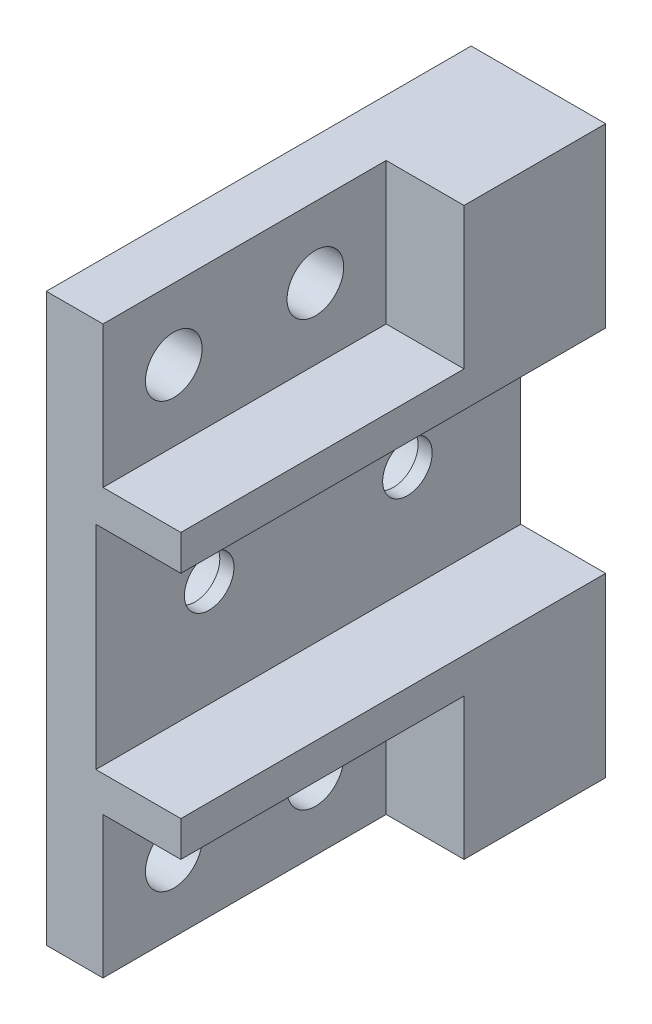
ISO-10303-21;
HEADER;
FILE_DESCRIPTION(('STEP AP214'),'2;1');
FILE_NAME('part.step','',(''),(''),'','','');
FILE_SCHEMA(('AUTOMOTIVE_DESIGN { 1 0 10303 214 1 1 1 1 }'));
ENDSEC;
DATA;
#1=APPLICATION_CONTEXT('core data for automotive mechanical design processes');
#2=APPLICATION_PROTOCOL_DEFINITION('international standard','automotive_design',2000,#1);
#3=PRODUCT_CONTEXT('',#1,'mechanical');
#4=PRODUCT('Part','Part','',(#3));
#5=PRODUCT_RELATED_PRODUCT_CATEGORY('part','',(#4));
#6=PRODUCT_DEFINITION_FORMATION('','',#4);
#7=PRODUCT_DEFINITION_CONTEXT('part definition',#1,'design');
#8=PRODUCT_DEFINITION('design','',#6,#7);
#9=PRODUCT_DEFINITION_SHAPE('','',#8);
#10=(LENGTH_UNIT() NAMED_UNIT(*) SI_UNIT(.MILLI.,.METRE.));
#11=(NAMED_UNIT(*) PLANE_ANGLE_UNIT() SI_UNIT($,.RADIAN.));
#12=(NAMED_UNIT(*) SI_UNIT($,.STERADIAN.) SOLID_ANGLE_UNIT());
#13=UNCERTAINTY_MEASURE_WITH_UNIT(LENGTH_MEASURE(1.E-05),#10,'distance_accuracy_value','');
#14=(GEOMETRIC_REPRESENTATION_CONTEXT(3) GLOBAL_UNCERTAINTY_ASSIGNED_CONTEXT((#13)) GLOBAL_UNIT_ASSIGNED_CONTEXT((#10,
#11,#12)) REPRESENTATION_CONTEXT('',''));
#15=CARTESIAN_POINT('',(0.,0.,0.));
#16=DIRECTION('',(0.,0.,1.));
#17=DIRECTION('',(1.,0.,0.));
#18=AXIS2_PLACEMENT_3D('',#15,#16,#17);
#19=CARTESIAN_POINT('',(0.,0.,30.));
#20=DIRECTION('',(0.,1.,0.));
#21=DIRECTION('',(-1.,0.,0.));
#22=AXIS2_PLACEMENT_3D('',#19,#20,#21);
#23=PLANE('',#22);
#24=DIRECTION('',(1.,0.,0.));
#25=VECTOR('',#24,1.);
#26=CARTESIAN_POINT('',(9.5,0.,10.));
#27=LINE('',#26,#25);
#28=CARTESIAN_POINT('',(4.,0.,10.));
#29=VERTEX_POINT('',#28);
#30=CARTESIAN_POINT('',(9.5,0.,10.));
#31=VERTEX_POINT('',#30);
#32=EDGE_CURVE('E307',#29,#31,#27,.T.);
#33=ORIENTED_EDGE('',*,*,#32,.T.);
#34=DIRECTION('',(0.,0.,-1.));
#35=VECTOR('',#34,1.);
#36=CARTESIAN_POINT('',(9.5,0.,30.));
#37=LINE('',#36,#35);
#38=CARTESIAN_POINT('',(9.5,0.,30.));
#39=VERTEX_POINT('',#38);
#40=EDGE_CURVE('E146',#39,#31,#37,.T.);
#41=ORIENTED_EDGE('',*,*,#40,.F.);
#42=DIRECTION('',(1.,0.,0.));
#43=VECTOR('',#42,1.);
#44=CARTESIAN_POINT('',(0.,0.,30.));
#45=LINE('',#44,#43);
#46=CARTESIAN_POINT('',(4.,0.,30.));
#47=VERTEX_POINT('',#46);
#48=EDGE_CURVE('E85',#47,#39,#45,.T.);
#49=ORIENTED_EDGE('',*,*,#48,.F.);
#50=DIRECTION('',(0.,0.,-1.));
#51=VECTOR('',#50,1.);
#52=CARTESIAN_POINT('',(4.,0.,30.));
#53=LINE('',#52,#51);
#54=EDGE_CURVE('E218',#47,#29,#53,.T.);
#55=ORIENTED_EDGE('',*,*,#54,.T.);
#56=EDGE_LOOP('',(#33,#41,#49,#55));
#57=FACE_BOUND('',#56,.T.);
#58=ADVANCED_FACE('F32',(#57),#23,.F.);
#59=CARTESIAN_POINT('',(4.,0.,0.));
#60=DIRECTION('',(1.,0.,0.));
#61=DIRECTION('',(0.,0.,-1.));
#62=AXIS2_PLACEMENT_3D('',#59,#60,#61);
#63=PLANE('',#62);
#64=CARTESIAN_POINT('',(4.,-5.,15.));
#65=DIRECTION('',(-1.,0.,0.));
#66=DIRECTION('',(0.,0.,1.));
#67=AXIS2_PLACEMENT_3D('',#64,#65,#66);
#68=CIRCLE('',#67,2.);
#69=CARTESIAN_POINT('',(4.,-5.,17.));
#70=VERTEX_POINT('',#69);
#71=EDGE_CURVE('E210',#70,#70,#68,.T.);
#72=ORIENTED_EDGE('',*,*,#71,.T.);
#73=EDGE_LOOP('',(#72));
#74=FACE_BOUND('',#73,.T.);
#75=CARTESIAN_POINT('',(4.,-5.,25.));
#76=DIRECTION('',(-1.,0.,0.));
#77=DIRECTION('',(0.,0.,1.));
#78=AXIS2_PLACEMENT_3D('',#75,#76,#77);
#79=CIRCLE('',#78,2.);
#80=CARTESIAN_POINT('',(4.,-5.,27.));
#81=VERTEX_POINT('',#80);
#82=EDGE_CURVE('E204',#81,#81,#79,.T.);
#83=ORIENTED_EDGE('',*,*,#82,.T.);
#84=EDGE_LOOP('',(#83));
#85=FACE_BOUND('',#84,.T.);
#86=DIRECTION('',(0.,0.,1.));
#87=VECTOR('',#86,1.);
#88=CARTESIAN_POINT('',(4.,-10.,30.));
#89=LINE('',#88,#87);
#90=CARTESIAN_POINT('',(4.,-10.,10.));
#91=VERTEX_POINT('',#90);
#92=CARTESIAN_POINT('',(4.,-10.,30.));
#93=VERTEX_POINT('',#92);
#94=EDGE_CURVE('E221',#91,#93,#89,.T.);
#95=ORIENTED_EDGE('',*,*,#94,.F.);
#96=DIRECTION('',(0.,1.,0.));
#97=VECTOR('',#96,1.);
#98=CARTESIAN_POINT('',(4.,0.,10.));
#99=LINE('',#98,#97);
#100=EDGE_CURVE('E11',#91,#29,#99,.T.);
#101=ORIENTED_EDGE('',*,*,#100,.T.);
#102=ORIENTED_EDGE('',*,*,#54,.F.);
#103=DIRECTION('',(0.,1.,0.));
#104=VECTOR('',#103,1.);
#105=CARTESIAN_POINT('',(4.,0.,30.));
#106=LINE('',#105,#104);
#107=EDGE_CURVE('E216',#93,#47,#106,.T.);
#108=ORIENTED_EDGE('',*,*,#107,.F.);
#109=EDGE_LOOP('',(#95,#101,#102,#108));
#110=FACE_BOUND('',#109,.T.);
#111=ADVANCED_FACE('F302',(#74,#85,#110),#63,.T.);
#112=CARTESIAN_POINT('',(0.,10.,22.));
#113=DIRECTION('',(1.,0.,0.));
#114=DIRECTION('',(0.,0.,-1.));
#115=AXIS2_PLACEMENT_3D('',#112,#113,#114);
#116=CYLINDRICAL_SURFACE('',#115,1.75);
#117=CARTESIAN_POINT('',(3.5,10.,22.));
#118=DIRECTION('',(1.,0.,0.));
#119=DIRECTION('',(0.,0.,-1.));
#120=AXIS2_PLACEMENT_3D('',#117,#118,#119);
#121=CIRCLE('',#120,1.75);
#122=CARTESIAN_POINT('',(3.5,10.,20.25));
#123=VERTEX_POINT('',#122);
#124=EDGE_CURVE('E129',#123,#123,#121,.T.);
#125=ORIENTED_EDGE('',*,*,#124,.T.);
#126=EDGE_LOOP('',(#125));
#127=FACE_BOUND('',#126,.T.);
#128=CARTESIAN_POINT('',(2.5,10.,22.));
#129=DIRECTION('',(-1.,0.,0.));
#130=DIRECTION('',(0.,0.,1.));
#131=AXIS2_PLACEMENT_3D('',#128,#129,#130);
#132=CIRCLE('',#131,1.75);
#133=CARTESIAN_POINT('',(2.5,10.,23.75));
#134=VERTEX_POINT('',#133);
#135=EDGE_CURVE('E154',#134,#134,#132,.F.);
#136=ORIENTED_EDGE('',*,*,#135,.F.);
#137=EDGE_LOOP('',(#136));
#138=FACE_BOUND('',#137,.T.);
#139=ADVANCED_FACE('F347',(#127,#138),#116,.F.);
#140=CARTESIAN_POINT('',(0.,10.,8.));
#141=DIRECTION('',(1.,0.,0.));
#142=DIRECTION('',(0.,0.,-1.));
#143=AXIS2_PLACEMENT_3D('',#140,#141,#142);
#144=CYLINDRICAL_SURFACE('',#143,1.75);
#145=CARTESIAN_POINT('',(3.5,10.,8.));
#146=DIRECTION('',(1.,0.,0.));
#147=DIRECTION('',(0.,0.,-1.));
#148=AXIS2_PLACEMENT_3D('',#145,#146,#147);
#149=CIRCLE('',#148,1.75);
#150=CARTESIAN_POINT('',(3.5,10.,6.25));
#151=VERTEX_POINT('',#150);
#152=EDGE_CURVE('E152',#151,#151,#149,.T.);
#153=ORIENTED_EDGE('',*,*,#152,.T.);
#154=EDGE_LOOP('',(#153));
#155=FACE_BOUND('',#154,.T.);
#156=CARTESIAN_POINT('',(2.5,10.,8.));
#157=DIRECTION('',(-1.,0.,0.));
#158=DIRECTION('',(0.,0.,1.));
#159=AXIS2_PLACEMENT_3D('',#156,#157,#158);
#160=CIRCLE('',#159,1.75);
#161=CARTESIAN_POINT('',(2.5,10.,9.75));
#162=VERTEX_POINT('',#161);
#163=EDGE_CURVE('E149',#162,#162,#160,.F.);
#164=ORIENTED_EDGE('',*,*,#163,.F.);
#165=EDGE_LOOP('',(#164));
#166=FACE_BOUND('',#165,.T.);
#167=ADVANCED_FACE('F340',(#155,#166),#144,.F.);
#168=CARTESIAN_POINT('',(0.,0.,30.));
#169=DIRECTION('',(1.,0.,0.));
#170=DIRECTION('',(0.,0.,-1.));
#171=AXIS2_PLACEMENT_3D('',#168,#169,#170);
#172=PLANE('',#171);
#173=DIRECTION('',(0.,-1.,0.));
#174=VECTOR('',#173,1.);
#175=CARTESIAN_POINT('',(0.,0.,0.));
#176=LINE('',#175,#174);
#177=CARTESIAN_POINT('',(0.,30.,0.));
#178=VERTEX_POINT('',#177);
#179=CARTESIAN_POINT('',(0.,-10.,0.));
#180=VERTEX_POINT('',#179);
#181=EDGE_CURVE('E125',#178,#180,#176,.T.);
#182=ORIENTED_EDGE('',*,*,#181,.T.);
#183=DIRECTION('',(0.,0.,1.));
#184=VECTOR('',#183,1.);
#185=CARTESIAN_POINT('',(0.,-10.,30.));
#186=LINE('',#185,#184);
#187=CARTESIAN_POINT('',(0.,-10.,30.));
#188=VERTEX_POINT('',#187);
#189=EDGE_CURVE('E213',#180,#188,#186,.T.);
#190=ORIENTED_EDGE('',*,*,#189,.T.);
#191=DIRECTION('',(0.,-1.,0.));
#192=VECTOR('',#191,1.);
#193=CARTESIAN_POINT('',(0.,0.,30.));
#194=LINE('',#193,#192);
#195=CARTESIAN_POINT('',(0.,30.,30.));
#196=VERTEX_POINT('',#195);
#197=EDGE_CURVE('E138',#196,#188,#194,.T.);
#198=ORIENTED_EDGE('',*,*,#197,.F.);
#199=DIRECTION('',(0.,0.,-1.));
#200=VECTOR('',#199,1.);
#201=CARTESIAN_POINT('',(0.,30.,0.));
#202=LINE('',#201,#200);
#203=EDGE_CURVE('E185',#196,#178,#202,.T.);
#204=ORIENTED_EDGE('',*,*,#203,.T.);
#205=EDGE_LOOP('',(#182,#190,#198,#204));
#206=FACE_BOUND('',#205,.T.);
#207=CARTESIAN_POINT('',(0.,10.,22.));
#208=DIRECTION('',(-1.,0.,0.));
#209=DIRECTION('',(0.,0.,1.));
#210=AXIS2_PLACEMENT_3D('',#207,#208,#209);
#211=CIRCLE('',#210,3.);
#212=CARTESIAN_POINT('',(0.,10.,25.));
#213=VERTEX_POINT('',#212);
#214=EDGE_CURVE('E230',#213,#213,#211,.T.);
#215=ORIENTED_EDGE('',*,*,#214,.F.);
#216=EDGE_LOOP('',(#215));
#217=FACE_BOUND('',#216,.T.);
#218=CARTESIAN_POINT('',(0.,10.,8.));
#219=DIRECTION('',(-1.,0.,0.));
#220=DIRECTION('',(0.,0.,1.));
#221=AXIS2_PLACEMENT_3D('',#218,#219,#220);
#222=CIRCLE('',#221,3.);
#223=CARTESIAN_POINT('',(0.,10.,11.));
#224=VERTEX_POINT('',#223);
#225=EDGE_CURVE('E156',#224,#224,#222,.T.);
#226=ORIENTED_EDGE('',*,*,#225,.F.);
#227=EDGE_LOOP('',(#226));
#228=FACE_BOUND('',#227,.T.);
#229=CARTESIAN_POINT('',(0.,-5.,25.));
#230=DIRECTION('',(-1.,0.,0.));
#231=DIRECTION('',(0.,0.,1.));
#232=AXIS2_PLACEMENT_3D('',#229,#230,#231);
#233=CIRCLE('',#232,2.);
#234=CARTESIAN_POINT('',(0.,-5.,27.));
#235=VERTEX_POINT('',#234);
#236=EDGE_CURVE('E201',#235,#235,#233,.T.);
#237=ORIENTED_EDGE('',*,*,#236,.F.);
#238=EDGE_LOOP('',(#237));
#239=FACE_BOUND('',#238,.T.);
#240=CARTESIAN_POINT('',(0.,-5.,15.));
#241=DIRECTION('',(-1.,0.,0.));
#242=DIRECTION('',(0.,0.,1.));
#243=AXIS2_PLACEMENT_3D('',#240,#241,#242);
#244=CIRCLE('',#243,2.);
#245=CARTESIAN_POINT('',(0.,-5.,17.));
#246=VERTEX_POINT('',#245);
#247=EDGE_CURVE('E207',#246,#246,#244,.T.);
#248=ORIENTED_EDGE('',*,*,#247,.F.);
#249=EDGE_LOOP('',(#248));
#250=FACE_BOUND('',#249,.T.);
#251=CARTESIAN_POINT('',(0.,25.,25.));
#252=DIRECTION('',(-1.,0.,0.));
#253=DIRECTION('',(0.,0.,1.));
#254=AXIS2_PLACEMENT_3D('',#251,#252,#253);
#255=CIRCLE('',#254,2.00000000000001);
#256=CARTESIAN_POINT('',(0.,25.,27.));
#257=VERTEX_POINT('',#256);
#258=EDGE_CURVE('E178',#257,#257,#255,.T.);
#259=ORIENTED_EDGE('',*,*,#258,.F.);
#260=EDGE_LOOP('',(#259));
#261=FACE_BOUND('',#260,.T.);
#262=CARTESIAN_POINT('',(0.,25.,15.));
#263=DIRECTION('',(-1.,0.,0.));
#264=DIRECTION('',(0.,0.,1.));
#265=AXIS2_PLACEMENT_3D('',#262,#263,#264);
#266=CIRCLE('',#265,2.00000000000001);
#267=CARTESIAN_POINT('',(0.,25.,17.));
#268=VERTEX_POINT('',#267);
#269=EDGE_CURVE('E193',#268,#268,#266,.T.);
#270=ORIENTED_EDGE('',*,*,#269,.F.);
#271=EDGE_LOOP('',(#270));
#272=FACE_BOUND('',#271,.T.);
#273=ADVANCED_FACE('F34',(#206,#217,#228,#239,#250,#261,#272),#172,.F.);
#274=CARTESIAN_POINT('',(9.5,2.5,30.));
#275=DIRECTION('',(-1.,0.,0.));
#276=DIRECTION('',(0.,0.,1.));
#277=AXIS2_PLACEMENT_3D('',#274,#275,#276);
#278=PLANE('',#277);
#279=DIRECTION('',(0.,1.,0.));
#280=VECTOR('',#279,1.);
#281=CARTESIAN_POINT('',(9.5,2.5,0.));
#282=LINE('',#281,#280);
#283=CARTESIAN_POINT('',(9.5,-10.,0.));
#284=VERTEX_POINT('',#283);
#285=CARTESIAN_POINT('',(9.5,2.5,0.));
#286=VERTEX_POINT('',#285);
#287=EDGE_CURVE('E128',#284,#286,#282,.T.);
#288=ORIENTED_EDGE('',*,*,#287,.T.);
#289=DIRECTION('',(0.,0.,-1.));
#290=VECTOR('',#289,1.);
#291=CARTESIAN_POINT('',(9.5,2.5,30.));
#292=LINE('',#291,#290);
#293=CARTESIAN_POINT('',(9.5,2.5,30.));
#294=VERTEX_POINT('',#293);
#295=EDGE_CURVE('E143',#294,#286,#292,.T.);
#296=ORIENTED_EDGE('',*,*,#295,.F.);
#297=DIRECTION('',(0.,1.,0.));
#298=VECTOR('',#297,1.);
#299=CARTESIAN_POINT('',(9.5,2.5,30.));
#300=LINE('',#299,#298);
#301=EDGE_CURVE('E247',#39,#294,#300,.T.);
#302=ORIENTED_EDGE('',*,*,#301,.F.);
#303=ORIENTED_EDGE('',*,*,#40,.T.);
#304=DIRECTION('',(0.,-1.,0.));
#305=VECTOR('',#304,1.);
#306=CARTESIAN_POINT('',(9.5,0.,10.));
#307=LINE('',#306,#305);
#308=CARTESIAN_POINT('',(9.5,-10.,10.));
#309=VERTEX_POINT('',#308);
#310=EDGE_CURVE('E311',#31,#309,#307,.T.);
#311=ORIENTED_EDGE('',*,*,#310,.T.);
#312=DIRECTION('',(0.,0.,-1.));
#313=VECTOR('',#312,1.);
#314=CARTESIAN_POINT('',(9.5,-10.,10.));
#315=LINE('',#314,#313);
#316=EDGE_CURVE('E318',#309,#284,#315,.T.);
#317=ORIENTED_EDGE('',*,*,#316,.T.);
#318=EDGE_LOOP('',(#288,#296,#302,#303,#311,#317));
#319=FACE_BOUND('',#318,.T.);
#320=ADVANCED_FACE('F251',(#319),#278,.F.);
#321=CARTESIAN_POINT('',(3.5,2.5,30.));
#322=DIRECTION('',(0.,-1.,0.));
#323=DIRECTION('',(1.,0.,0.));
#324=AXIS2_PLACEMENT_3D('',#321,#322,#323);
#325=PLANE('',#324);
#326=DIRECTION('',(-1.,0.,0.));
#327=VECTOR('',#326,1.);
#328=CARTESIAN_POINT('',(3.5,2.5,0.));
#329=LINE('',#328,#327);
#330=CARTESIAN_POINT('',(3.5,2.5,0.));
#331=VERTEX_POINT('',#330);
#332=EDGE_CURVE('E131',#286,#331,#329,.T.);
#333=ORIENTED_EDGE('',*,*,#332,.T.);
#334=DIRECTION('',(0.,0.,-1.));
#335=VECTOR('',#334,1.);
#336=CARTESIAN_POINT('',(3.5,2.5,30.));
#337=LINE('',#336,#335);
#338=CARTESIAN_POINT('',(3.5,2.5,30.));
#339=VERTEX_POINT('',#338);
#340=EDGE_CURVE('E115',#339,#331,#337,.T.);
#341=ORIENTED_EDGE('',*,*,#340,.F.);
#342=DIRECTION('',(-1.,0.,0.));
#343=VECTOR('',#342,1.);
#344=CARTESIAN_POINT('',(3.5,2.5,30.));
#345=LINE('',#344,#343);
#346=EDGE_CURVE('E103',#294,#339,#345,.T.);
#347=ORIENTED_EDGE('',*,*,#346,.F.);
#348=ORIENTED_EDGE('',*,*,#295,.T.);
#349=EDGE_LOOP('',(#333,#341,#347,#348));
#350=FACE_BOUND('',#349,.T.);
#351=ADVANCED_FACE('F256',(#350),#325,.F.);
#352=CARTESIAN_POINT('',(3.5,17.5,30.));
#353=DIRECTION('',(-1.,0.,0.));
#354=DIRECTION('',(0.,-1.,0.));
#355=AXIS2_PLACEMENT_3D('',#352,#353,#354);
#356=PLANE('',#355);
#357=ORIENTED_EDGE('',*,*,#152,.F.);
#358=EDGE_LOOP('',(#357));
#359=FACE_BOUND('',#358,.T.);
#360=ORIENTED_EDGE('',*,*,#124,.F.);
#361=EDGE_LOOP('',(#360));
#362=FACE_BOUND('',#361,.T.);
#363=DIRECTION('',(0.,1.,0.));
#364=VECTOR('',#363,1.);
#365=CARTESIAN_POINT('',(3.5,17.5,0.));
#366=LINE('',#365,#364);
#367=CARTESIAN_POINT('',(3.5,17.5,0.));
#368=VERTEX_POINT('',#367);
#369=EDGE_CURVE('E112',#331,#368,#366,.T.);
#370=ORIENTED_EDGE('',*,*,#369,.T.);
#371=DIRECTION('',(0.,0.,-1.));
#372=VECTOR('',#371,1.);
#373=CARTESIAN_POINT('',(3.5,17.5,30.));
#374=LINE('',#373,#372);
#375=CARTESIAN_POINT('',(3.5,17.5,30.));
#376=VERTEX_POINT('',#375);
#377=EDGE_CURVE('E109',#376,#368,#374,.T.);
#378=ORIENTED_EDGE('',*,*,#377,.F.);
#379=DIRECTION('',(0.,1.,0.));
#380=VECTOR('',#379,1.);
#381=CARTESIAN_POINT('',(3.5,17.5,30.));
#382=LINE('',#381,#380);
#383=EDGE_CURVE('E96',#339,#376,#382,.T.);
#384=ORIENTED_EDGE('',*,*,#383,.F.);
#385=ORIENTED_EDGE('',*,*,#340,.T.);
#386=EDGE_LOOP('',(#370,#378,#384,#385));
#387=FACE_BOUND('',#386,.T.);
#388=ADVANCED_FACE('F110',(#359,#362,#387),#356,.F.);
#389=CARTESIAN_POINT('',(9.5,17.5,30.));
#390=DIRECTION('',(0.,1.,0.));
#391=DIRECTION('',(-1.,0.,0.));
#392=AXIS2_PLACEMENT_3D('',#389,#390,#391);
#393=PLANE('',#392);
#394=ORIENTED_EDGE('',*,*,#377,.T.);
#395=DIRECTION('',(1.,0.,0.));
#396=VECTOR('',#395,1.);
#397=CARTESIAN_POINT('',(9.5,17.5,0.));
#398=LINE('',#397,#396);
#399=CARTESIAN_POINT('',(9.5,17.5,0.));
#400=VERTEX_POINT('',#399);
#401=EDGE_CURVE('E134',#368,#400,#398,.T.);
#402=ORIENTED_EDGE('',*,*,#401,.T.);
#403=DIRECTION('',(0.,0.,-1.));
#404=VECTOR('',#403,1.);
#405=CARTESIAN_POINT('',(9.5,17.5,30.));
#406=LINE('',#405,#404);
#407=CARTESIAN_POINT('',(9.5,17.5,30.));
#408=VERTEX_POINT('',#407);
#409=EDGE_CURVE('E77',#408,#400,#406,.T.);
#410=ORIENTED_EDGE('',*,*,#409,.F.);
#411=DIRECTION('',(1.,0.,0.));
#412=VECTOR('',#411,1.);
#413=CARTESIAN_POINT('',(9.5,17.5,30.));
#414=LINE('',#413,#412);
#415=EDGE_CURVE('E101',#376,#408,#414,.T.);
#416=ORIENTED_EDGE('',*,*,#415,.F.);
#417=EDGE_LOOP('',(#394,#402,#410,#416));
#418=FACE_BOUND('',#417,.T.);
#419=ADVANCED_FACE('F117',(#418),#393,.F.);
#420=CARTESIAN_POINT('',(9.5,20.,30.));
#421=DIRECTION('',(-1.,0.,0.));
#422=DIRECTION('',(0.,0.,1.));
#423=AXIS2_PLACEMENT_3D('',#420,#421,#422);
#424=PLANE('',#423);
#425=ORIENTED_EDGE('',*,*,#409,.T.);
#426=DIRECTION('',(0.,1.,0.));
#427=VECTOR('',#426,1.);
#428=CARTESIAN_POINT('',(9.5,20.,0.));
#429=LINE('',#428,#427);
#430=CARTESIAN_POINT('',(9.5,30.,0.));
#431=VERTEX_POINT('',#430);
#432=EDGE_CURVE('E136',#400,#431,#429,.T.);
#433=ORIENTED_EDGE('',*,*,#432,.T.);
#434=DIRECTION('',(0.,0.,-1.));
#435=VECTOR('',#434,1.);
#436=CARTESIAN_POINT('',(9.5,30.,10.));
#437=LINE('',#436,#435);
#438=CARTESIAN_POINT('',(9.5,30.,10.));
#439=VERTEX_POINT('',#438);
#440=EDGE_CURVE('E179',#439,#431,#437,.T.);
#441=ORIENTED_EDGE('',*,*,#440,.F.);
#442=DIRECTION('',(0.,-1.,0.));
#443=VECTOR('',#442,1.);
#444=CARTESIAN_POINT('',(9.5,17.5,10.));
#445=LINE('',#444,#443);
#446=CARTESIAN_POINT('',(9.5,20.,10.));
#447=VERTEX_POINT('',#446);
#448=EDGE_CURVE('E319',#439,#447,#445,.T.);
#449=ORIENTED_EDGE('',*,*,#448,.T.);
#450=DIRECTION('',(0.,0.,-1.));
#451=VECTOR('',#450,1.);
#452=CARTESIAN_POINT('',(9.5,20.,30.));
#453=LINE('',#452,#451);
#454=CARTESIAN_POINT('',(9.5,20.,30.));
#455=VERTEX_POINT('',#454);
#456=EDGE_CURVE('E124',#455,#447,#453,.T.);
#457=ORIENTED_EDGE('',*,*,#456,.F.);
#458=DIRECTION('',(0.,1.,0.));
#459=VECTOR('',#458,1.);
#460=CARTESIAN_POINT('',(9.5,20.,30.));
#461=LINE('',#460,#459);
#462=EDGE_CURVE('E56',#408,#455,#461,.T.);
#463=ORIENTED_EDGE('',*,*,#462,.F.);
#464=EDGE_LOOP('',(#425,#433,#441,#449,#457,#463));
#465=FACE_BOUND('',#464,.T.);
#466=ADVANCED_FACE('F265',(#465),#424,.F.);
#467=CARTESIAN_POINT('',(0.,20.,30.));
#468=DIRECTION('',(0.,-1.,0.));
#469=DIRECTION('',(1.,0.,0.));
#470=AXIS2_PLACEMENT_3D('',#467,#468,#469);
#471=PLANE('',#470);
#472=ORIENTED_EDGE('',*,*,#456,.T.);
#473=DIRECTION('',(-1.,0.,0.));
#474=VECTOR('',#473,1.);
#475=CARTESIAN_POINT('',(0.,20.,10.));
#476=LINE('',#475,#474);
#477=CARTESIAN_POINT('',(4.,20.,10.));
#478=VERTEX_POINT('',#477);
#479=EDGE_CURVE('E167',#447,#478,#476,.T.);
#480=ORIENTED_EDGE('',*,*,#479,.T.);
#481=DIRECTION('',(0.,0.,1.));
#482=VECTOR('',#481,1.);
#483=CARTESIAN_POINT('',(4.,20.,0.));
#484=LINE('',#483,#482);
#485=CARTESIAN_POINT('',(4.,20.,30.));
#486=VERTEX_POINT('',#485);
#487=EDGE_CURVE('E47',#478,#486,#484,.T.);
#488=ORIENTED_EDGE('',*,*,#487,.T.);
#489=DIRECTION('',(-1.,0.,0.));
#490=VECTOR('',#489,1.);
#491=CARTESIAN_POINT('',(0.,20.,30.));
#492=LINE('',#491,#490);
#493=EDGE_CURVE('E119',#455,#486,#492,.T.);
#494=ORIENTED_EDGE('',*,*,#493,.F.);
#495=EDGE_LOOP('',(#472,#480,#488,#494));
#496=FACE_BOUND('',#495,.T.);
#497=ADVANCED_FACE('F177',(#496),#471,.F.);
#498=CARTESIAN_POINT('',(0.,0.,30.));
#499=DIRECTION('',(0.,0.,-1.));
#500=DIRECTION('',(-1.,0.,0.));
#501=AXIS2_PLACEMENT_3D('',#498,#499,#500);
#502=PLANE('',#501);
#503=ORIENTED_EDGE('',*,*,#197,.T.);
#504=DIRECTION('',(-1.,0.,0.));
#505=VECTOR('',#504,1.);
#506=CARTESIAN_POINT('',(4.,-10.,30.));
#507=LINE('',#506,#505);
#508=EDGE_CURVE('E227',#93,#188,#507,.T.);
#509=ORIENTED_EDGE('',*,*,#508,.F.);
#510=ORIENTED_EDGE('',*,*,#107,.T.);
#511=ORIENTED_EDGE('',*,*,#48,.T.);
#512=ORIENTED_EDGE('',*,*,#301,.T.);
#513=ORIENTED_EDGE('',*,*,#346,.T.);
#514=ORIENTED_EDGE('',*,*,#383,.T.);
#515=ORIENTED_EDGE('',*,*,#415,.T.);
#516=ORIENTED_EDGE('',*,*,#462,.T.);
#517=ORIENTED_EDGE('',*,*,#493,.T.);
#518=DIRECTION('',(0.,1.,0.));
#519=VECTOR('',#518,1.);
#520=CARTESIAN_POINT('',(4.,20.,30.));
#521=LINE('',#520,#519);
#522=CARTESIAN_POINT('',(4.,30.,30.));
#523=VERTEX_POINT('',#522);
#524=EDGE_CURVE('E184',#486,#523,#521,.T.);
#525=ORIENTED_EDGE('',*,*,#524,.T.);
#526=DIRECTION('',(-1.,0.,0.));
#527=VECTOR('',#526,1.);
#528=CARTESIAN_POINT('',(4.,30.,30.));
#529=LINE('',#528,#527);
#530=EDGE_CURVE('E196',#523,#196,#529,.T.);
#531=ORIENTED_EDGE('',*,*,#530,.T.);
#532=EDGE_LOOP('',(#503,#509,#510,#511,#512,#513,#514,#515,#516,#517,#525,#531));
#533=FACE_BOUND('',#532,.T.);
#534=ADVANCED_FACE('F99',(#533),#502,.F.);
#535=CARTESIAN_POINT('',(0.,0.,0.));
#536=DIRECTION('',(0.,0.,-1.));
#537=DIRECTION('',(-1.,0.,0.));
#538=AXIS2_PLACEMENT_3D('',#535,#536,#537);
#539=PLANE('',#538);
#540=CARTESIAN_POINT('',(5.,-5.,0.));
#541=DIRECTION('',(0.,0.,-1.));
#542=DIRECTION('',(-1.,0.,0.));
#543=AXIS2_PLACEMENT_3D('',#540,#541,#542);
#544=CIRCLE('',#543,3.);
#545=CARTESIAN_POINT('',(2.,-5.,0.));
#546=VERTEX_POINT('',#545);
#547=EDGE_CURVE('E442',#546,#546,#544,.T.);
#548=ORIENTED_EDGE('',*,*,#547,.F.);
#549=EDGE_LOOP('',(#548));
#550=FACE_BOUND('',#549,.T.);
#551=CARTESIAN_POINT('',(5.,25.,0.));
#552=DIRECTION('',(0.,0.,-1.));
#553=DIRECTION('',(-1.,0.,0.));
#554=AXIS2_PLACEMENT_3D('',#551,#552,#553);
#555=CIRCLE('',#554,3.);
#556=CARTESIAN_POINT('',(2.,25.,0.));
#557=VERTEX_POINT('',#556);
#558=EDGE_CURVE('E441',#557,#557,#555,.T.);
#559=ORIENTED_EDGE('',*,*,#558,.F.);
#560=EDGE_LOOP('',(#559));
#561=FACE_BOUND('',#560,.T.);
#562=DIRECTION('',(-1.,0.,0.));
#563=VECTOR('',#562,1.);
#564=CARTESIAN_POINT('',(4.,-10.,0.));
#565=LINE('',#564,#563);
#566=EDGE_CURVE('E224',#284,#180,#565,.T.);
#567=ORIENTED_EDGE('',*,*,#566,.T.);
#568=ORIENTED_EDGE('',*,*,#181,.F.);
#569=DIRECTION('',(-1.,0.,0.));
#570=VECTOR('',#569,1.);
#571=CARTESIAN_POINT('',(4.,30.,0.));
#572=LINE('',#571,#570);
#573=EDGE_CURVE('E198',#431,#178,#572,.T.);
#574=ORIENTED_EDGE('',*,*,#573,.F.);
#575=ORIENTED_EDGE('',*,*,#432,.F.);
#576=ORIENTED_EDGE('',*,*,#401,.F.);
#577=ORIENTED_EDGE('',*,*,#369,.F.);
#578=ORIENTED_EDGE('',*,*,#332,.F.);
#579=ORIENTED_EDGE('',*,*,#287,.F.);
#580=EDGE_LOOP('',(#567,#568,#574,#575,#576,#577,#578,#579));
#581=FACE_BOUND('',#580,.T.);
#582=ADVANCED_FACE('F258',(#550,#561,#581),#539,.T.);
#583=CARTESIAN_POINT('',(2.5,10.,8.));
#584=DIRECTION('',(-1.,0.,0.));
#585=DIRECTION('',(0.,0.,1.));
#586=AXIS2_PLACEMENT_3D('',#583,#584,#585);
#587=PLANE('',#586);
#588=CARTESIAN_POINT('',(2.5,10.,8.));
#589=DIRECTION('',(-1.,0.,0.));
#590=DIRECTION('',(0.,0.,1.));
#591=AXIS2_PLACEMENT_3D('',#588,#589,#590);
#592=CIRCLE('',#591,3.);
#593=CARTESIAN_POINT('',(2.5,10.,11.));
#594=VERTEX_POINT('',#593);
#595=EDGE_CURVE('E153',#594,#594,#592,.T.);
#596=ORIENTED_EDGE('',*,*,#595,.T.);
#597=EDGE_LOOP('',(#596));
#598=FACE_BOUND('',#597,.T.);
#599=ORIENTED_EDGE('',*,*,#163,.T.);
#600=EDGE_LOOP('',(#599));
#601=FACE_BOUND('',#600,.T.);
#602=ADVANCED_FACE('F371',(#598,#601),#587,.T.);
#603=CARTESIAN_POINT('',(2.5,10.,8.));
#604=DIRECTION('',(-1.,0.,0.));
#605=DIRECTION('',(0.,0.,1.));
#606=AXIS2_PLACEMENT_3D('',#603,#604,#605);
#607=CYLINDRICAL_SURFACE('',#606,3.);
#608=ORIENTED_EDGE('',*,*,#595,.F.);
#609=EDGE_LOOP('',(#608));
#610=FACE_BOUND('',#609,.T.);
#611=ORIENTED_EDGE('',*,*,#225,.T.);
#612=EDGE_LOOP('',(#611));
#613=FACE_BOUND('',#612,.T.);
#614=ADVANCED_FACE('F378',(#610,#613),#607,.F.);
#615=CARTESIAN_POINT('',(2.5,10.,22.));
#616=DIRECTION('',(-1.,0.,0.));
#617=DIRECTION('',(0.,0.,1.));
#618=AXIS2_PLACEMENT_3D('',#615,#616,#617);
#619=PLANE('',#618);
#620=CARTESIAN_POINT('',(2.5,10.,22.));
#621=DIRECTION('',(-1.,0.,0.));
#622=DIRECTION('',(0.,0.,1.));
#623=AXIS2_PLACEMENT_3D('',#620,#621,#622);
#624=CIRCLE('',#623,3.);
#625=CARTESIAN_POINT('',(2.5,10.,25.));
#626=VERTEX_POINT('',#625);
#627=EDGE_CURVE('E157',#626,#626,#624,.T.);
#628=ORIENTED_EDGE('',*,*,#627,.T.);
#629=EDGE_LOOP('',(#628));
#630=FACE_BOUND('',#629,.T.);
#631=ORIENTED_EDGE('',*,*,#135,.T.);
#632=EDGE_LOOP('',(#631));
#633=FACE_BOUND('',#632,.T.);
#634=ADVANCED_FACE('F381',(#630,#633),#619,.T.);
#635=CARTESIAN_POINT('',(2.5,10.,22.));
#636=DIRECTION('',(-1.,0.,0.));
#637=DIRECTION('',(0.,0.,1.));
#638=AXIS2_PLACEMENT_3D('',#635,#636,#637);
#639=CYLINDRICAL_SURFACE('',#638,3.);
#640=ORIENTED_EDGE('',*,*,#627,.F.);
#641=EDGE_LOOP('',(#640));
#642=FACE_BOUND('',#641,.T.);
#643=ORIENTED_EDGE('',*,*,#214,.T.);
#644=EDGE_LOOP('',(#643));
#645=FACE_BOUND('',#644,.T.);
#646=ADVANCED_FACE('F386',(#642,#645),#639,.F.);
#647=CARTESIAN_POINT('',(4.,-10.,30.));
#648=DIRECTION('',(0.,-1.,0.));
#649=DIRECTION('',(0.,0.,-1.));
#650=AXIS2_PLACEMENT_3D('',#647,#648,#649);
#651=PLANE('',#650);
#652=DIRECTION('',(-1.,0.,0.));
#653=VECTOR('',#652,1.);
#654=CARTESIAN_POINT('',(9.5,-10.,10.));
#655=LINE('',#654,#653);
#656=EDGE_CURVE('E300',#309,#91,#655,.T.);
#657=ORIENTED_EDGE('',*,*,#656,.T.);
#658=ORIENTED_EDGE('',*,*,#94,.T.);
#659=ORIENTED_EDGE('',*,*,#508,.T.);
#660=ORIENTED_EDGE('',*,*,#189,.F.);
#661=ORIENTED_EDGE('',*,*,#566,.F.);
#662=ORIENTED_EDGE('',*,*,#316,.F.);
#663=EDGE_LOOP('',(#657,#658,#659,#660,#661,#662));
#664=FACE_BOUND('',#663,.T.);
#665=ADVANCED_FACE('F296',(#664),#651,.T.);
#666=CARTESIAN_POINT('',(4.,-5.,15.));
#667=DIRECTION('',(-1.,0.,0.));
#668=DIRECTION('',(0.,0.,1.));
#669=AXIS2_PLACEMENT_3D('',#666,#667,#668);
#670=CYLINDRICAL_SURFACE('',#669,2.);
#671=ORIENTED_EDGE('',*,*,#71,.F.);
#672=EDGE_LOOP('',(#671));
#673=FACE_BOUND('',#672,.T.);
#674=ORIENTED_EDGE('',*,*,#247,.T.);
#675=EDGE_LOOP('',(#674));
#676=FACE_BOUND('',#675,.T.);
#677=ADVANCED_FACE('F394',(#673,#676),#670,.F.);
#678=CARTESIAN_POINT('',(4.,-5.,25.));
#679=DIRECTION('',(-1.,0.,0.));
#680=DIRECTION('',(0.,0.,1.));
#681=AXIS2_PLACEMENT_3D('',#678,#679,#680);
#682=CYLINDRICAL_SURFACE('',#681,2.);
#683=ORIENTED_EDGE('',*,*,#82,.F.);
#684=EDGE_LOOP('',(#683));
#685=FACE_BOUND('',#684,.T.);
#686=ORIENTED_EDGE('',*,*,#236,.T.);
#687=EDGE_LOOP('',(#686));
#688=FACE_BOUND('',#687,.T.);
#689=ADVANCED_FACE('F398',(#685,#688),#682,.F.);
#690=CARTESIAN_POINT('',(4.,30.,0.));
#691=DIRECTION('',(0.,1.,0.));
#692=DIRECTION('',(0.,0.,1.));
#693=AXIS2_PLACEMENT_3D('',#690,#691,#692);
#694=PLANE('',#693);
#695=DIRECTION('',(0.,0.,-1.));
#696=VECTOR('',#695,1.);
#697=CARTESIAN_POINT('',(4.,30.,0.));
#698=LINE('',#697,#696);
#699=CARTESIAN_POINT('',(4.,30.,10.));
#700=VERTEX_POINT('',#699);
#701=EDGE_CURVE('E187',#523,#700,#698,.T.);
#702=ORIENTED_EDGE('',*,*,#701,.T.);
#703=DIRECTION('',(1.,0.,0.));
#704=VECTOR('',#703,1.);
#705=CARTESIAN_POINT('',(9.5,30.,10.));
#706=LINE('',#705,#704);
#707=EDGE_CURVE('E171',#700,#439,#706,.T.);
#708=ORIENTED_EDGE('',*,*,#707,.T.);
#709=ORIENTED_EDGE('',*,*,#440,.T.);
#710=ORIENTED_EDGE('',*,*,#573,.T.);
#711=ORIENTED_EDGE('',*,*,#203,.F.);
#712=ORIENTED_EDGE('',*,*,#530,.F.);
#713=EDGE_LOOP('',(#702,#708,#709,#710,#711,#712));
#714=FACE_BOUND('',#713,.T.);
#715=ADVANCED_FACE('F402',(#714),#694,.T.);
#716=CARTESIAN_POINT('',(4.,0.,0.));
#717=DIRECTION('',(1.,0.,0.));
#718=DIRECTION('',(0.,0.,-1.));
#719=AXIS2_PLACEMENT_3D('',#716,#717,#718);
#720=PLANE('',#719);
#721=DIRECTION('',(0.,-1.,0.));
#722=VECTOR('',#721,1.);
#723=CARTESIAN_POINT('',(4.,0.,10.));
#724=LINE('',#723,#722);
#725=EDGE_CURVE('E40',#700,#478,#724,.T.);
#726=ORIENTED_EDGE('',*,*,#725,.F.);
#727=ORIENTED_EDGE('',*,*,#701,.F.);
#728=ORIENTED_EDGE('',*,*,#524,.F.);
#729=ORIENTED_EDGE('',*,*,#487,.F.);
#730=EDGE_LOOP('',(#726,#727,#728,#729));
#731=FACE_BOUND('',#730,.T.);
#732=CARTESIAN_POINT('',(4.,25.,25.));
#733=DIRECTION('',(-1.,0.,0.));
#734=DIRECTION('',(0.,0.,1.));
#735=AXIS2_PLACEMENT_3D('',#732,#733,#734);
#736=CIRCLE('',#735,2.00000000000001);
#737=CARTESIAN_POINT('',(4.,25.,27.));
#738=VERTEX_POINT('',#737);
#739=EDGE_CURVE('E327',#738,#738,#736,.T.);
#740=ORIENTED_EDGE('',*,*,#739,.T.);
#741=EDGE_LOOP('',(#740));
#742=FACE_BOUND('',#741,.T.);
#743=CARTESIAN_POINT('',(4.,25.,15.));
#744=DIRECTION('',(-1.,0.,0.));
#745=DIRECTION('',(0.,0.,1.));
#746=AXIS2_PLACEMENT_3D('',#743,#744,#745);
#747=CIRCLE('',#746,2.00000000000001);
#748=CARTESIAN_POINT('',(4.,25.,17.));
#749=VERTEX_POINT('',#748);
#750=EDGE_CURVE('E190',#749,#749,#747,.T.);
#751=ORIENTED_EDGE('',*,*,#750,.T.);
#752=EDGE_LOOP('',(#751));
#753=FACE_BOUND('',#752,.T.);
#754=ADVANCED_FACE('F181',(#731,#742,#753),#720,.T.);
#755=CARTESIAN_POINT('',(4.,25.,15.));
#756=DIRECTION('',(-1.,0.,0.));
#757=DIRECTION('',(0.,0.,1.));
#758=AXIS2_PLACEMENT_3D('',#755,#756,#757);
#759=CYLINDRICAL_SURFACE('',#758,2.00000000000001);
#760=ORIENTED_EDGE('',*,*,#750,.F.);
#761=EDGE_LOOP('',(#760));
#762=FACE_BOUND('',#761,.T.);
#763=ORIENTED_EDGE('',*,*,#269,.T.);
#764=EDGE_LOOP('',(#763));
#765=FACE_BOUND('',#764,.T.);
#766=ADVANCED_FACE('F337',(#762,#765),#759,.F.);
#767=CARTESIAN_POINT('',(4.,25.,25.));
#768=DIRECTION('',(-1.,0.,0.));
#769=DIRECTION('',(0.,0.,1.));
#770=AXIS2_PLACEMENT_3D('',#767,#768,#769);
#771=CYLINDRICAL_SURFACE('',#770,2.00000000000001);
#772=ORIENTED_EDGE('',*,*,#739,.F.);
#773=EDGE_LOOP('',(#772));
#774=FACE_BOUND('',#773,.T.);
#775=ORIENTED_EDGE('',*,*,#258,.T.);
#776=EDGE_LOOP('',(#775));
#777=FACE_BOUND('',#776,.T.);
#778=ADVANCED_FACE('F411',(#774,#777),#771,.F.);
#779=CARTESIAN_POINT('',(0.,0.,10.));
#780=DIRECTION('',(0.,0.,1.));
#781=DIRECTION('',(1.,0.,0.));
#782=AXIS2_PLACEMENT_3D('',#779,#780,#781);
#783=PLANE('',#782);
#784=ORIENTED_EDGE('',*,*,#479,.F.);
#785=ORIENTED_EDGE('',*,*,#448,.F.);
#786=ORIENTED_EDGE('',*,*,#707,.F.);
#787=ORIENTED_EDGE('',*,*,#725,.T.);
#788=EDGE_LOOP('',(#784,#785,#786,#787));
#789=FACE_BOUND('',#788,.T.);
#790=ADVANCED_FACE('F164',(#789),#783,.T.);
#791=CARTESIAN_POINT('',(0.,0.,10.));
#792=DIRECTION('',(0.,0.,-1.));
#793=DIRECTION('',(-1.,0.,0.));
#794=AXIS2_PLACEMENT_3D('',#791,#792,#793);
#795=PLANE('',#794);
#796=ORIENTED_EDGE('',*,*,#100,.F.);
#797=ORIENTED_EDGE('',*,*,#656,.F.);
#798=ORIENTED_EDGE('',*,*,#310,.F.);
#799=ORIENTED_EDGE('',*,*,#32,.F.);
#800=EDGE_LOOP('',(#796,#797,#798,#799));
#801=FACE_BOUND('',#800,.T.);
#802=ADVANCED_FACE('F418',(#801),#795,.F.);
#803=CARTESIAN_POINT('',(5.,25.,8.));
#804=DIRECTION('',(0.,0.,-1.));
#805=DIRECTION('',(-1.,0.,0.));
#806=AXIS2_PLACEMENT_3D('',#803,#804,#805);
#807=CYLINDRICAL_SURFACE('',#806,3.);
#808=CARTESIAN_POINT('',(5.,25.,8.));
#809=DIRECTION('',(0.,0.,-1.));
#810=DIRECTION('',(-1.,0.,0.));
#811=AXIS2_PLACEMENT_3D('',#808,#809,#810);
#812=CIRCLE('',#811,3.);
#813=CARTESIAN_POINT('',(2.,25.,8.));
#814=VERTEX_POINT('',#813);
#815=EDGE_CURVE('E445',#814,#814,#812,.T.);
#816=ORIENTED_EDGE('',*,*,#815,.F.);
#817=EDGE_LOOP('',(#816));
#818=FACE_BOUND('',#817,.T.);
#819=ORIENTED_EDGE('',*,*,#558,.T.);
#820=EDGE_LOOP('',(#819));
#821=FACE_BOUND('',#820,.T.);
#822=ADVANCED_FACE('F421',(#818,#821),#807,.F.);
#823=CARTESIAN_POINT('',(5.,25.,8.));
#824=DIRECTION('',(0.,0.,-1.));
#825=DIRECTION('',(-1.,0.,0.));
#826=AXIS2_PLACEMENT_3D('',#823,#824,#825);
#827=PLANE('',#826);
#828=ORIENTED_EDGE('',*,*,#815,.T.);
#829=EDGE_LOOP('',(#828));
#830=FACE_BOUND('',#829,.T.);
#831=ADVANCED_FACE('F424',(#830),#827,.T.);
#832=CARTESIAN_POINT('',(5.,-5.,8.));
#833=DIRECTION('',(0.,0.,-1.));
#834=DIRECTION('',(-1.,0.,0.));
#835=AXIS2_PLACEMENT_3D('',#832,#833,#834);
#836=CYLINDRICAL_SURFACE('',#835,3.);
#837=CARTESIAN_POINT('',(5.,-5.,8.));
#838=DIRECTION('',(0.,0.,-1.));
#839=DIRECTION('',(-1.,0.,0.));
#840=AXIS2_PLACEMENT_3D('',#837,#838,#839);
#841=CIRCLE('',#840,3.);
#842=CARTESIAN_POINT('',(2.,-5.,8.));
#843=VERTEX_POINT('',#842);
#844=EDGE_CURVE('E440',#843,#843,#841,.T.);
#845=ORIENTED_EDGE('',*,*,#844,.F.);
#846=EDGE_LOOP('',(#845));
#847=FACE_BOUND('',#846,.T.);
#848=ORIENTED_EDGE('',*,*,#547,.T.);
#849=EDGE_LOOP('',(#848));
#850=FACE_BOUND('',#849,.T.);
#851=ADVANCED_FACE('F428',(#847,#850),#836,.F.);
#852=CARTESIAN_POINT('',(5.,-5.,8.));
#853=DIRECTION('',(0.,0.,-1.));
#854=DIRECTION('',(-1.,0.,0.));
#855=AXIS2_PLACEMENT_3D('',#852,#853,#854);
#856=PLANE('',#855);
#857=ORIENTED_EDGE('',*,*,#844,.T.);
#858=EDGE_LOOP('',(#857));
#859=FACE_BOUND('',#858,.T.);
#860=ADVANCED_FACE('F432',(#859),#856,.T.);
#861=CLOSED_SHELL('',(#58,#111,#139,#167,#273,#320,#351,#388,#419,#466,#497,#534,#582,#602,#614,
#634,#646,#665,#677,#689,#715,#754,#766,#778,#790,#802,#822,#831,#851,#860));
#862=MANIFOLD_SOLID_BREP('B2',#861);
#863=ADVANCED_BREP_SHAPE_REPRESENTATION('',(#18,#862),#14);
#864=SHAPE_DEFINITION_REPRESENTATION(#9,#863);
ENDSEC;
END-ISO-10303-21;
